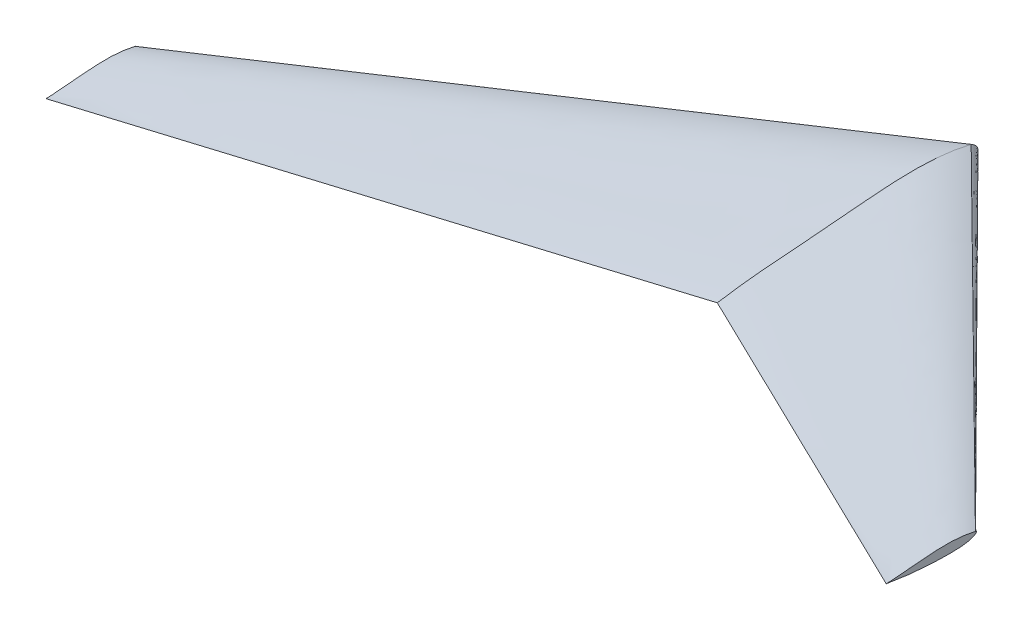
ISO-10303-21;
HEADER;
FILE_DESCRIPTION(('STEP AP214'),'2;1');
FILE_NAME('part.step','',(''),(''),'','','');
FILE_SCHEMA(('AUTOMOTIVE_DESIGN { 1 0 10303 214 1 1 1 1 }'));
ENDSEC;
DATA;
#1=APPLICATION_CONTEXT('core data for automotive mechanical design processes');
#2=APPLICATION_PROTOCOL_DEFINITION('international standard','automotive_design',2000,#1);
#3=PRODUCT_CONTEXT('',#1,'mechanical');
#4=PRODUCT('Part','Part','',(#3));
#5=PRODUCT_RELATED_PRODUCT_CATEGORY('part','',(#4));
#6=PRODUCT_DEFINITION_FORMATION('','',#4);
#7=PRODUCT_DEFINITION_CONTEXT('part definition',#1,'design');
#8=PRODUCT_DEFINITION('design','',#6,#7);
#9=PRODUCT_DEFINITION_SHAPE('','',#8);
#10=(LENGTH_UNIT() NAMED_UNIT(*) SI_UNIT(.MILLI.,.METRE.));
#11=(NAMED_UNIT(*) PLANE_ANGLE_UNIT() SI_UNIT($,.RADIAN.));
#12=(NAMED_UNIT(*) SI_UNIT($,.STERADIAN.) SOLID_ANGLE_UNIT());
#13=UNCERTAINTY_MEASURE_WITH_UNIT(LENGTH_MEASURE(1.E-05),#10,'distance_accuracy_value','');
#14=(GEOMETRIC_REPRESENTATION_CONTEXT(3) GLOBAL_UNCERTAINTY_ASSIGNED_CONTEXT((#13)) GLOBAL_UNIT_ASSIGNED_CONTEXT((#10,
#11,#12)) REPRESENTATION_CONTEXT('',''));
#15=CARTESIAN_POINT('',(0.,0.,0.));
#16=DIRECTION('',(0.,0.,1.));
#17=DIRECTION('',(1.,0.,0.));
#18=AXIS2_PLACEMENT_3D('',#15,#16,#17);
#19=CARTESIAN_POINT('',(-7316.724,1517.25414267266,42630.863513884));
#20=DIRECTION('',(1.,0.,0.));
#21=DIRECTION('',(0.,0.,-1.));
#22=AXIS2_PLACEMENT_3D('',#19,#20,#21);
#23=PLANE('',#22);
#24=CARTESIAN_POINT('',(-7316.724,1607.87103490155,43425.9996952478));
#25=CARTESIAN_POINT('',(-7316.724,1555.39925492584,43124.4968417218));
#26=CARTESIAN_POINT('',(-7316.724,1514.78014399578,42753.537351778));
#27=CARTESIAN_POINT('',(-7316.724,1508.49824953525,42318.4831494068));
#28=CARTESIAN_POINT('',(-7316.724,1512.09143573163,42150.8328227834));
#29=CARTESIAN_POINT('',(-7316.724,1527.63326012394,42017.7703808411));
#30=CARTESIAN_POINT('',(-7316.724,1548.21679473457,41934.0506650661));
#31=CARTESIAN_POINT('',(-7316.724,1575.37805651124,41880.4209024113));
#32=CARTESIAN_POINT('',(-7316.724,1595.11148192768,41858.8785953058));
#33=CARTESIAN_POINT('',(-7316.724,1608.25446851606,41855.2374706269));
#34=B_SPLINE_CURVE_WITH_KNOTS('',3,(#24,#25,#26,#27,#28,#29,#30,#31,#32,#33),.UNSPECIFIED.,.F.,
.F.,(4,1,1,1,1,1,1,4),(0.,0.573703222355154,0.696558971393613,0.815363791904487,
0.88738243947835,0.947637452928242,0.975206514001847,1.),.UNSPECIFIED.);
#35=CARTESIAN_POINT('',(-7316.724,1607.87103490155,43425.9996952478));
#36=VERTEX_POINT('',#35);
#37=CARTESIAN_POINT('',(-7316.724,1608.25446851606,41855.2374706269));
#38=VERTEX_POINT('',#37);
#39=EDGE_CURVE('E282',#36,#38,#34,.T.);
#40=ORIENTED_EDGE('',*,*,#39,.F.);
#41=CARTESIAN_POINT('',(-7316.724,1621.31177155191,41873.5940554683));
#42=CARTESIAN_POINT('',(-7316.724,1685.43227110332,42131.8894584282));
#43=CARTESIAN_POINT('',(-7316.724,1686.20816247974,42487.637139249));
#44=CARTESIAN_POINT('',(-7316.724,1646.05614064644,42910.3773015501));
#45=CARTESIAN_POINT('',(-7316.724,1630.10397434548,43112.0017166179));
#46=CARTESIAN_POINT('',(-7316.724,1616.08872758674,43276.8689167987));
#47=CARTESIAN_POINT('',(-7316.724,1606.75653531742,43371.1181603463));
#48=CARTESIAN_POINT('',(-7316.724,1607.87103490155,43425.9996952478));
#49=B_SPLINE_CURVE_WITH_KNOTS('',3,(#41,#42,#43,#44,#45,#46,#47,#48),.UNSPECIFIED.,.F.,.F.,(4,1,
1,1,1,4),(0.,0.5053105144252,0.681423174405816,0.817681999319828,0.894695451658962,1.),.UNSPECIFIED.);
#50=CARTESIAN_POINT('',(-7316.724,1621.31177155191,41873.5940554683));
#51=VERTEX_POINT('',#50);
#52=EDGE_CURVE('E285',#51,#36,#49,.T.);
#53=ORIENTED_EDGE('',*,*,#52,.F.);
#54=CARTESIAN_POINT('',(-7316.724,1608.25446851606,41855.2374706269));
#55=CARTESIAN_POINT('',(-7316.724,1619.29840859538,41861.2189813848));
#56=CARTESIAN_POINT('',(-7316.724,1621.31177155191,41873.5940554683));
#57=B_SPLINE_CURVE_WITH_KNOTS('',2,(#54,#55,#56),.UNSPECIFIED.,.F.,.F.,(3,3),(0.,1.),.UNSPECIFIED.);
#58=EDGE_CURVE('E305',#38,#51,#57,.T.);
#59=ORIENTED_EDGE('',*,*,#58,.F.);
#60=EDGE_LOOP('',(#40,#53,#59));
#61=FACE_BOUND('',#60,.T.);
#62=ADVANCED_FACE('F71',(#61),#23,.F.);
#63=CARTESIAN_POINT('',(-7316.724,1607.87103490155,43425.9996952478));
#64=CARTESIAN_POINT('',(0.,0.,39051.8308678376));
#65=CARTESIAN_POINT('',(-7316.724,1555.39925492584,43124.4968417218));
#66=CARTESIAN_POINT('',(0.,-125.815178037406,38557.6314716903));
#67=CARTESIAN_POINT('',(-7316.724,1514.78014399578,42753.537351778));
#68=CARTESIAN_POINT('',(0.,-183.132872432479,37942.9351329729));
#69=CARTESIAN_POINT('',(-7316.724,1508.49824953525,42318.4831494068));
#70=CARTESIAN_POINT('',(0.,-236.206325415725,37221.5114335912));
#71=CARTESIAN_POINT('',(-7316.724,1512.09143573163,42150.8328227834));
#72=CARTESIAN_POINT('',(0.,-258.229151170553,36944.262288796));
#73=CARTESIAN_POINT('',(-7316.724,1527.63326012394,42017.7703808411));
#74=CARTESIAN_POINT('',(0.,-278.995937285097,36722.8582574191));
#75=CARTESIAN_POINT('',(-7316.724,1548.21679473457,41934.0506650661));
#76=CARTESIAN_POINT('',(0.,-294.1701771121,36582.222753078));
#77=CARTESIAN_POINT('',(-7316.724,1575.37805651124,41880.4209024113));
#78=CARTESIAN_POINT('',(0.,-305.997548201537,36483.3200579316));
#79=CARTESIAN_POINT('',(-7316.724,1595.11148192768,41858.8785953058));
#80=CARTESIAN_POINT('',(0.,-311.840015754821,36437.3893170317));
#81=CARTESIAN_POINT('',(-7316.724,1608.25446851606,41855.2374706269));
#82=CARTESIAN_POINT('',(0.,-314.689043667158,36415.6544771106));
#83=B_SPLINE_SURFACE_WITH_KNOTS('',3,1,((#63,#64),(#65,#66),(#67,#68),(#69,#70),(#71,#72),(#73,
#74),(#75,#76),(#77,#78),(#79,#80),(#81,#82)),.UNSPECIFIED.,.F.,.F.,.F.,(4,1,1,1,1,1,1,4),(2,2),
(0.,0.573703222355154,0.696558971393613,0.815363791904487,0.88738243947835,0.947637452928242,
0.975206514001847,1.),(0.,1.),.UNSPECIFIED.);
#84=DIRECTION('',(0.785242357781532,-0.206373330111598,-0.583784624809827));
#85=VECTOR('',#84,1.);
#86=CARTESIAN_POINT('',(-3658.362,646.78271242445,39135.4459738687));
#87=LINE('',#86,#85);
#88=CARTESIAN_POINT('',(0.,-314.689043667158,36415.6544771106));
#89=VERTEX_POINT('',#88);
#90=EDGE_CURVE('E84',#38,#89,#87,.T.);
#91=CARTESIAN_POINT('',(0.,0.,39051.8308678376));
#92=CARTESIAN_POINT('',(0.,-219.303593103264,38190.4109264983));
#93=CARTESIAN_POINT('',(0.,-199.778703404803,37292.2895708103));
#94=CARTESIAN_POINT('',(0.,-314.689043667158,36415.6544771106));
#95=B_SPLINE_CURVE_WITH_KNOTS('',3,(#91,#92,#93,#94),.UNSPECIFIED.,.F.,.F.,(4,4),(0.,1.),.UNSPECIFIED.);
#96=CARTESIAN_POINT('',(0.,0.,39051.8308678376));
#97=VERTEX_POINT('',#96);
#98=EDGE_CURVE('E78',#97,#89,#95,.T.);
#99=DIRECTION('',(-0.843440814883087,0.185348532472221,0.504235573219252));
#100=VECTOR('',#99,1.);
#101=CARTESIAN_POINT('',(-3658.362,803.935517450775,41238.9152815427));
#102=LINE('',#101,#100);
#103=EDGE_CURVE('E356',#97,#36,#102,.T.);
#104=ORIENTED_EDGE('',*,*,#39,.T.);
#105=ORIENTED_EDGE('',*,*,#90,.T.);
#106=ORIENTED_EDGE('',*,*,#98,.F.);
#107=ORIENTED_EDGE('',*,*,#103,.T.);
#108=EDGE_LOOP('',(#104,#105,#106,#107));
#109=FACE_BOUND('',#108,.T.);
#110=ADVANCED_FACE('F322',(#109),#83,.T.);
#111=CARTESIAN_POINT('',(-7316.724,1608.25446851606,41855.2374706269));
#112=CARTESIAN_POINT('',(0.,-314.689043667158,36415.6544771106));
#113=CARTESIAN_POINT('',(-7316.724,1612.95817241695,41857.7850447067));
#114=CARTESIAN_POINT('',(0.,-355.496530662122,35966.3295593621));
#115=CARTESIAN_POINT('',(-7316.724,1617.32799924236,41862.082313709));
#116=CARTESIAN_POINT('',(0.,-490.286226797262,35302.3778794593));
#117=CARTESIAN_POINT('',(-7316.724,1620.3493000199,41869.1436053186));
#118=CARTESIAN_POINT('',(0.,-191.536723391741,34639.9796136509));
#119=CARTESIAN_POINT('',(-7316.724,1621.04781510975,41871.9716552369));
#120=CARTESIAN_POINT('',(0.,59.40404363458,34412.4230882716));
#121=CARTESIAN_POINT('',(-7316.724,1621.31177155191,41873.5940554683));
#122=CARTESIAN_POINT('',(0.,179.281535270434,34630.3278420353));
#123=B_SPLINE_SURFACE_WITH_KNOTS('',3,1,((#111,#112),(#113,#114),(#115,#116),(#117,#118),(#119,
#120),(#121,#122)),.UNSPECIFIED.,.F.,.F.,.F.,(4,1,1,4),(2,2),(0.,0.638862199601095,
0.803346603772833,1.),(0.,1.),.UNSPECIFIED.);
#124=DIRECTION('',(0.703795365074699,-0.138708826052818,-0.696729463762241));
#125=VECTOR('',#124,1.);
#126=CARTESIAN_POINT('',(-3658.362,900.296653411171,38251.9609487518));
#127=LINE('',#126,#125);
#128=CARTESIAN_POINT('',(0.,179.281535270434,34630.3278420353));
#129=VERTEX_POINT('',#128);
#130=EDGE_CURVE('E12',#51,#129,#127,.T.);
#131=CARTESIAN_POINT('',(0.,-314.689043667158,36415.6544771106));
#132=CARTESIAN_POINT('',(0.,-355.496530662122,35966.3295593621));
#133=CARTESIAN_POINT('',(0.,-490.286226797262,35302.3778794593));
#134=CARTESIAN_POINT('',(0.,-191.536723391741,34639.9796136509));
#135=CARTESIAN_POINT('',(0.,59.40404363458,34412.4230882716));
#136=CARTESIAN_POINT('',(0.,179.281535270434,34630.3278420353));
#137=B_SPLINE_CURVE_WITH_KNOTS('',3,(#131,#132,#133,#134,#135,#136),.UNSPECIFIED.,.F.,.F.,(4,1,
1,4),(0.,0.638862199601095,0.803346603772833,1.),.UNSPECIFIED.);
#138=EDGE_CURVE('E96',#89,#129,#137,.T.);
#139=ORIENTED_EDGE('',*,*,#58,.T.);
#140=ORIENTED_EDGE('',*,*,#130,.T.);
#141=ORIENTED_EDGE('',*,*,#138,.F.);
#142=ORIENTED_EDGE('',*,*,#90,.F.);
#143=EDGE_LOOP('',(#139,#140,#141,#142));
#144=FACE_BOUND('',#143,.T.);
#145=ADVANCED_FACE('F311',(#144),#123,.T.);
#146=CARTESIAN_POINT('',(-7316.724,1621.31177155191,41873.5940554683));
#147=CARTESIAN_POINT('',(0.,179.281535270434,34630.3278420353));
#148=CARTESIAN_POINT('',(-7316.724,1685.43227110332,42131.8894584282));
#149=CARTESIAN_POINT('',(0.,360.784253310991,35373.7082321234));
#150=CARTESIAN_POINT('',(-7316.724,1686.06558253451,42422.2639615238));
#151=CARTESIAN_POINT('',(0.,271.040560055052,36194.1488072132));
#152=CARTESIAN_POINT('',(-7316.724,1658.89598769361,42775.193099689));
#153=CARTESIAN_POINT('',(0.,179.846888845276,37200.8216559851));
#154=CARTESIAN_POINT('',(-7316.724,1643.97119900298,42936.7295305441));
#155=CARTESIAN_POINT('',(0.,146.74669014276,37662.4911550111));
#156=CARTESIAN_POINT('',(-7316.724,1630.10397434548,43112.0017166179));
#157=CARTESIAN_POINT('',(0.,110.144400161858,38162.0145062102));
#158=CARTESIAN_POINT('',(-7316.724,1616.08872758674,43276.8689167987));
#159=CARTESIAN_POINT('',(0.,62.821276040656,38630.6737855855));
#160=CARTESIAN_POINT('',(-7316.724,1606.75653531742,43371.1181603463));
#161=CARTESIAN_POINT('',(0.,26.0362153357611,38897.9132161209));
#162=CARTESIAN_POINT('',(-7316.724,1607.87103490155,43425.9996952478));
#163=CARTESIAN_POINT('',(0.,0.,39051.8308678376));
#164=B_SPLINE_SURFACE_WITH_KNOTS('',3,1,((#146,#147),(#148,#149),(#150,#151),(#152,#153),(#154,
#155),(#156,#157),(#158,#159),(#160,#161),(#162,#163)),.UNSPECIFIED.,.F.,.F.,.F.,(4,1,1,1,1,1,
4),(2,2),(0.,0.5053105144252,0.556202967253114,0.681423174405816,0.817681999319828,
0.894695451658962,1.),(0.,1.),.UNSPECIFIED.);
#165=CARTESIAN_POINT('',(0.,179.281535270434,34630.3278420353));
#166=CARTESIAN_POINT('',(0.,379.064337046286,35448.57794165));
#167=CARTESIAN_POINT('',(0.,165.287314982708,36924.0486557539));
#168=CARTESIAN_POINT('',(0.,109.727407714134,38403.1580593467));
#169=CARTESIAN_POINT('',(0.,0.,39051.8308678376));
#170=B_SPLINE_CURVE_WITH_KNOTS('',3,(#165,#166,#167,#168,#169),.UNSPECIFIED.,.F.,.F.,(4,1,4),
(0.,0.556202967253114,1.),.UNSPECIFIED.);
#171=EDGE_CURVE('E265',#129,#97,#170,.T.);
#172=ORIENTED_EDGE('',*,*,#52,.T.);
#173=ORIENTED_EDGE('',*,*,#103,.F.);
#174=ORIENTED_EDGE('',*,*,#171,.F.);
#175=ORIENTED_EDGE('',*,*,#130,.F.);
#176=EDGE_LOOP('',(#172,#173,#174,#175));
#177=FACE_BOUND('',#176,.T.);
#178=ADVANCED_FACE('F73',(#177),#164,.T.);
#179=CARTESIAN_POINT('',(7316.724,1517.25414267266,42630.863513884));
#180=DIRECTION('',(-1.,0.,0.));
#181=DIRECTION('',(0.,0.,-1.));
#182=AXIS2_PLACEMENT_3D('',#179,#180,#181);
#183=PLANE('',#182);
#184=CARTESIAN_POINT('',(7316.724,1607.87103490155,43425.9996952478));
#185=CARTESIAN_POINT('',(7316.724,1555.39925492584,43124.4968417218));
#186=CARTESIAN_POINT('',(7316.724,1514.78014399578,42753.537351778));
#187=CARTESIAN_POINT('',(7316.724,1508.49824953525,42318.4831494068));
#188=CARTESIAN_POINT('',(7316.724,1512.09143573163,42150.8328227834));
#189=CARTESIAN_POINT('',(7316.724,1527.63326012394,42017.7703808411));
#190=CARTESIAN_POINT('',(7316.724,1548.21679473457,41934.0506650661));
#191=CARTESIAN_POINT('',(7316.724,1575.37805651124,41880.4209024113));
#192=CARTESIAN_POINT('',(7316.724,1595.11148192768,41858.8785953058));
#193=CARTESIAN_POINT('',(7316.724,1608.25446851606,41855.2374706269));
#194=B_SPLINE_CURVE_WITH_KNOTS('',3,(#184,#185,#186,#187,#188,#189,#190,#191,#192,#193),
.UNSPECIFIED.,.F.,.F.,(4,1,1,1,1,1,1,4),(0.,0.573703222355154,0.696558971393613,
0.815363791904487,0.88738243947835,0.947637452928242,0.975206514001847,1.),.UNSPECIFIED.);
#195=CARTESIAN_POINT('',(7316.724,1607.87103490155,43425.9996952478));
#196=VERTEX_POINT('',#195);
#197=CARTESIAN_POINT('',(7316.724,1608.25446851606,41855.2374706269));
#198=VERTEX_POINT('',#197);
#199=EDGE_CURVE('E126',#196,#198,#194,.T.);
#200=ORIENTED_EDGE('',*,*,#199,.T.);
#201=CARTESIAN_POINT('',(7316.724,1608.25446851606,41855.2374706269));
#202=CARTESIAN_POINT('',(7316.724,1619.29840859538,41861.2189813848));
#203=CARTESIAN_POINT('',(7316.724,1621.31177155191,41873.5940554683));
#204=B_SPLINE_CURVE_WITH_KNOTS('',2,(#201,#202,#203),.UNSPECIFIED.,.F.,.F.,(3,3),(0.,1.),.UNSPECIFIED.);
#205=CARTESIAN_POINT('',(7316.724,1621.31177155191,41873.5940554683));
#206=VERTEX_POINT('',#205);
#207=EDGE_CURVE('E135',#198,#206,#204,.T.);
#208=ORIENTED_EDGE('',*,*,#207,.T.);
#209=CARTESIAN_POINT('',(7316.724,1621.31177155191,41873.5940554683));
#210=CARTESIAN_POINT('',(7316.724,1685.43227110332,42131.8894584282));
#211=CARTESIAN_POINT('',(7316.724,1686.20816247974,42487.637139249));
#212=CARTESIAN_POINT('',(7316.724,1646.05614064644,42910.3773015501));
#213=CARTESIAN_POINT('',(7316.724,1630.10397434548,43112.0017166179));
#214=CARTESIAN_POINT('',(7316.724,1616.08872758674,43276.8689167987));
#215=CARTESIAN_POINT('',(7316.724,1606.75653531742,43371.1181603463));
#216=CARTESIAN_POINT('',(7316.724,1607.87103490155,43425.9996952478));
#217=B_SPLINE_CURVE_WITH_KNOTS('',3,(#209,#210,#211,#212,#213,#214,#215,#216),.UNSPECIFIED.,.F.,
.F.,(4,1,1,1,1,4),(0.,0.5053105144252,0.681423174405816,0.817681999319828,0.894695451658962,1.),.UNSPECIFIED.);
#218=EDGE_CURVE('E143',#206,#196,#217,.T.);
#219=ORIENTED_EDGE('',*,*,#218,.T.);
#220=EDGE_LOOP('',(#200,#208,#219));
#221=FACE_BOUND('',#220,.T.);
#222=ADVANCED_FACE('F147',(#221),#183,.F.);
#223=CARTESIAN_POINT('',(7316.724,1607.87103490155,43425.9996952478));
#224=CARTESIAN_POINT('',(0.,0.,39051.8308678376));
#225=CARTESIAN_POINT('',(7316.724,1555.39925492584,43124.4968417218));
#226=CARTESIAN_POINT('',(0.,-125.815178037406,38557.6314716903));
#227=CARTESIAN_POINT('',(7316.724,1514.78014399578,42753.537351778));
#228=CARTESIAN_POINT('',(0.,-183.132872432479,37942.9351329729));
#229=CARTESIAN_POINT('',(7316.724,1508.49824953525,42318.4831494068));
#230=CARTESIAN_POINT('',(0.,-236.206325415725,37221.5114335912));
#231=CARTESIAN_POINT('',(7316.724,1512.09143573163,42150.8328227834));
#232=CARTESIAN_POINT('',(0.,-258.229151170553,36944.262288796));
#233=CARTESIAN_POINT('',(7316.724,1527.63326012394,42017.7703808411));
#234=CARTESIAN_POINT('',(0.,-278.995937285097,36722.8582574191));
#235=CARTESIAN_POINT('',(7316.724,1548.21679473457,41934.0506650661));
#236=CARTESIAN_POINT('',(0.,-294.1701771121,36582.222753078));
#237=CARTESIAN_POINT('',(7316.724,1575.37805651124,41880.4209024113));
#238=CARTESIAN_POINT('',(0.,-305.997548201537,36483.3200579316));
#239=CARTESIAN_POINT('',(7316.724,1595.11148192768,41858.8785953058));
#240=CARTESIAN_POINT('',(0.,-311.840015754821,36437.3893170317));
#241=CARTESIAN_POINT('',(7316.724,1608.25446851606,41855.2374706269));
#242=CARTESIAN_POINT('',(0.,-314.689043667158,36415.6544771106));
#243=B_SPLINE_SURFACE_WITH_KNOTS('',3,1,((#223,#224),(#225,#226),(#227,#228),(#229,#230),(#231,
#232),(#233,#234),(#235,#236),(#237,#238),(#239,#240),(#241,#242)),.UNSPECIFIED.,.F.,.F.,.F.,(4,
1,1,1,1,1,1,4),(2,2),(0.,0.573703222355154,0.696558971393613,0.815363791904487,0.88738243947835,
0.947637452928242,0.975206514001847,1.),(0.,1.),.UNSPECIFIED.);
#244=DIRECTION('',(0.843440814883087,0.185348532472221,0.504235573219252));
#245=VECTOR('',#244,1.);
#246=CARTESIAN_POINT('',(3658.362,803.935517450775,41238.9152815427));
#247=LINE('',#246,#245);
#248=EDGE_CURVE('E132',#97,#196,#247,.T.);
#249=DIRECTION('',(-0.785242357781532,-0.206373330111598,-0.583784624809827));
#250=VECTOR('',#249,1.);
#251=CARTESIAN_POINT('',(3658.362,646.78271242445,39135.4459738687));
#252=LINE('',#251,#250);
#253=EDGE_CURVE('E121',#198,#89,#252,.T.);
#254=ORIENTED_EDGE('',*,*,#199,.F.);
#255=ORIENTED_EDGE('',*,*,#248,.F.);
#256=ORIENTED_EDGE('',*,*,#98,.T.);
#257=ORIENTED_EDGE('',*,*,#253,.F.);
#258=EDGE_LOOP('',(#254,#255,#256,#257));
#259=FACE_BOUND('',#258,.T.);
#260=ADVANCED_FACE('F123',(#259),#243,.F.);
#261=CARTESIAN_POINT('',(7316.724,1608.25446851606,41855.2374706269));
#262=CARTESIAN_POINT('',(0.,-314.689043667158,36415.6544771106));
#263=CARTESIAN_POINT('',(7316.724,1612.95817241695,41857.7850447067));
#264=CARTESIAN_POINT('',(0.,-355.496530662122,35966.3295593621));
#265=CARTESIAN_POINT('',(7316.724,1617.32799924236,41862.082313709));
#266=CARTESIAN_POINT('',(0.,-490.286226797262,35302.3778794593));
#267=CARTESIAN_POINT('',(7316.724,1620.3493000199,41869.1436053186));
#268=CARTESIAN_POINT('',(0.,-191.536723391741,34639.9796136509));
#269=CARTESIAN_POINT('',(7316.724,1621.04781510975,41871.9716552369));
#270=CARTESIAN_POINT('',(0.,59.40404363458,34412.4230882716));
#271=CARTESIAN_POINT('',(7316.724,1621.31177155191,41873.5940554683));
#272=CARTESIAN_POINT('',(0.,179.281535270434,34630.3278420353));
#273=B_SPLINE_SURFACE_WITH_KNOTS('',3,1,((#261,#262),(#263,#264),(#265,#266),(#267,#268),(#269,
#270),(#271,#272)),.UNSPECIFIED.,.F.,.F.,.F.,(4,1,1,4),(2,2),(0.,0.638862199601095,
0.803346603772833,1.),(0.,1.),.UNSPECIFIED.);
#274=DIRECTION('',(-0.703795365074699,-0.138708826052818,-0.696729463762241));
#275=VECTOR('',#274,1.);
#276=CARTESIAN_POINT('',(3658.362,900.296653411171,38251.9609487518));
#277=LINE('',#276,#275);
#278=EDGE_CURVE('E131',#206,#129,#277,.T.);
#279=ORIENTED_EDGE('',*,*,#207,.F.);
#280=ORIENTED_EDGE('',*,*,#253,.T.);
#281=ORIENTED_EDGE('',*,*,#138,.T.);
#282=ORIENTED_EDGE('',*,*,#278,.F.);
#283=EDGE_LOOP('',(#279,#280,#281,#282));
#284=FACE_BOUND('',#283,.T.);
#285=ADVANCED_FACE('F137',(#284),#273,.F.);
#286=CARTESIAN_POINT('',(7316.724,1621.31177155191,41873.5940554683));
#287=CARTESIAN_POINT('',(0.,179.281535270434,34630.3278420353));
#288=CARTESIAN_POINT('',(7316.724,1685.43227110332,42131.8894584282));
#289=CARTESIAN_POINT('',(0.,360.784253310991,35373.7082321234));
#290=CARTESIAN_POINT('',(7316.724,1686.06558253451,42422.2639615238));
#291=CARTESIAN_POINT('',(0.,271.040560055052,36194.1488072132));
#292=CARTESIAN_POINT('',(7316.724,1658.89598769361,42775.193099689));
#293=CARTESIAN_POINT('',(0.,179.846888845276,37200.8216559851));
#294=CARTESIAN_POINT('',(7316.724,1643.97119900298,42936.7295305441));
#295=CARTESIAN_POINT('',(0.,146.74669014276,37662.4911550111));
#296=CARTESIAN_POINT('',(7316.724,1630.10397434548,43112.0017166179));
#297=CARTESIAN_POINT('',(0.,110.144400161858,38162.0145062102));
#298=CARTESIAN_POINT('',(7316.724,1616.08872758674,43276.8689167987));
#299=CARTESIAN_POINT('',(0.,62.821276040656,38630.6737855855));
#300=CARTESIAN_POINT('',(7316.724,1606.75653531742,43371.1181603463));
#301=CARTESIAN_POINT('',(0.,26.0362153357611,38897.9132161209));
#302=CARTESIAN_POINT('',(7316.724,1607.87103490155,43425.9996952478));
#303=CARTESIAN_POINT('',(0.,0.,39051.8308678376));
#304=B_SPLINE_SURFACE_WITH_KNOTS('',3,1,((#286,#287),(#288,#289),(#290,#291),(#292,#293),(#294,
#295),(#296,#297),(#298,#299),(#300,#301),(#302,#303)),.UNSPECIFIED.,.F.,.F.,.F.,(4,1,1,1,1,1,
4),(2,2),(0.,0.5053105144252,0.556202967253114,0.681423174405816,0.817681999319828,
0.894695451658962,1.),(0.,1.),.UNSPECIFIED.);
#305=ORIENTED_EDGE('',*,*,#218,.F.);
#306=ORIENTED_EDGE('',*,*,#278,.T.);
#307=ORIENTED_EDGE('',*,*,#171,.T.);
#308=ORIENTED_EDGE('',*,*,#248,.T.);
#309=EDGE_LOOP('',(#305,#306,#307,#308));
#310=FACE_BOUND('',#309,.T.);
#311=ADVANCED_FACE('F218',(#310),#304,.F.);
#312=CLOSED_SHELL('',(#62,#110,#145,#178,#222,#260,#285,#311));
#313=MANIFOLD_SOLID_BREP('B2',#312);
#314=ADVANCED_BREP_SHAPE_REPRESENTATION('',(#18,#313),#14);
#315=SHAPE_DEFINITION_REPRESENTATION(#9,#314);
ENDSEC;
END-ISO-10303-21;
